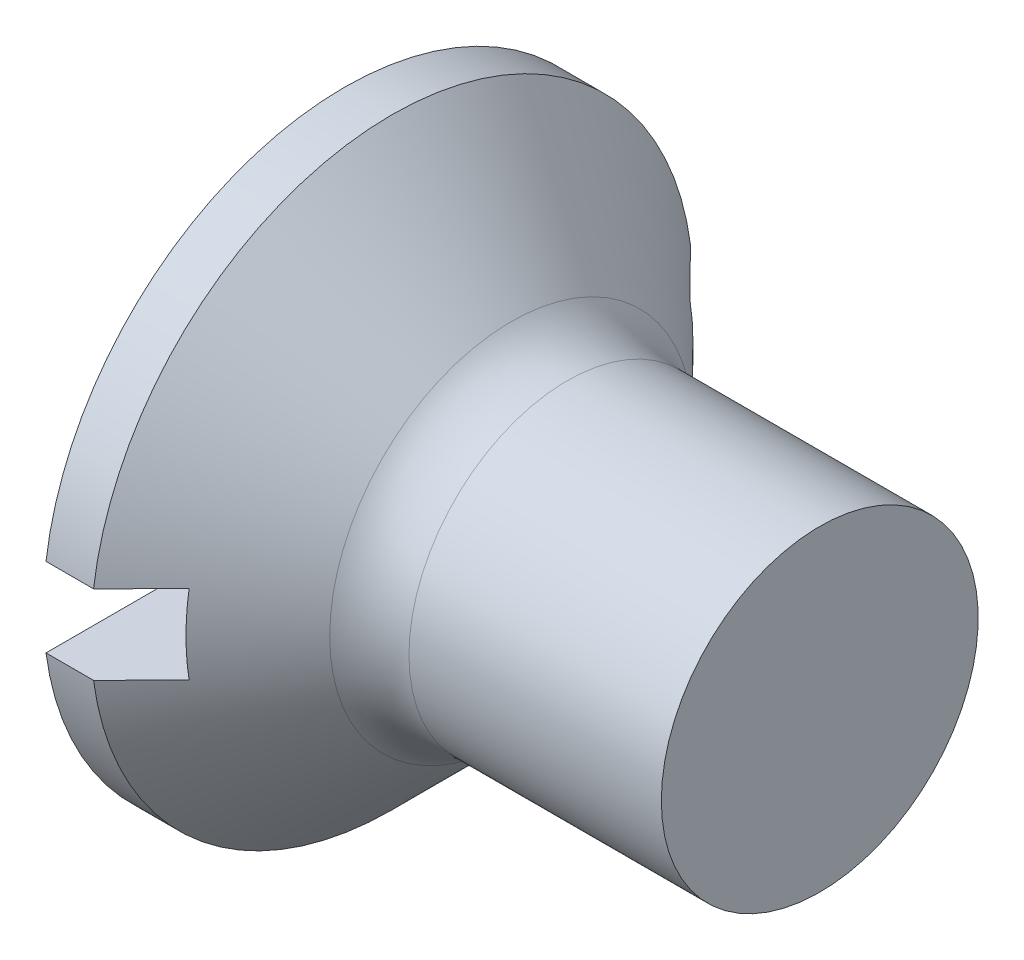
ISO-10303-21;
HEADER;
FILE_DESCRIPTION(('STEP AP214'),'2;1');
FILE_NAME('part.step','',(''),(''),'','','');
FILE_SCHEMA(('AUTOMOTIVE_DESIGN { 1 0 10303 214 1 1 1 1 }'));
ENDSEC;
DATA;
#1=APPLICATION_CONTEXT('core data for automotive mechanical design processes');
#2=APPLICATION_PROTOCOL_DEFINITION('international standard','automotive_design',2000,#1);
#3=PRODUCT_CONTEXT('',#1,'mechanical');
#4=PRODUCT('Part','Part','',(#3));
#5=PRODUCT_RELATED_PRODUCT_CATEGORY('part','',(#4));
#6=PRODUCT_DEFINITION_FORMATION('','',#4);
#7=PRODUCT_DEFINITION_CONTEXT('part definition',#1,'design');
#8=PRODUCT_DEFINITION('design','',#6,#7);
#9=PRODUCT_DEFINITION_SHAPE('','',#8);
#10=(LENGTH_UNIT() NAMED_UNIT(*) SI_UNIT(.MILLI.,.METRE.));
#11=(NAMED_UNIT(*) PLANE_ANGLE_UNIT() SI_UNIT($,.RADIAN.));
#12=(NAMED_UNIT(*) SI_UNIT($,.STERADIAN.) SOLID_ANGLE_UNIT());
#13=UNCERTAINTY_MEASURE_WITH_UNIT(LENGTH_MEASURE(1.E-05),#10,'distance_accuracy_value','');
#14=(GEOMETRIC_REPRESENTATION_CONTEXT(3) GLOBAL_UNCERTAINTY_ASSIGNED_CONTEXT((#13)) GLOBAL_UNIT_ASSIGNED_CONTEXT((#10,
#11,#12)) REPRESENTATION_CONTEXT('',''));
#15=CARTESIAN_POINT('',(0.,0.,0.));
#16=DIRECTION('',(0.,0.,1.));
#17=DIRECTION('',(1.,0.,0.));
#18=AXIS2_PLACEMENT_3D('',#15,#16,#17);
#19=CARTESIAN_POINT('',(0.,0.,0.));
#20=DIRECTION('',(-1.,0.,0.));
#21=DIRECTION('',(0.,0.,1.));
#22=AXIS2_PLACEMENT_3D('',#19,#20,#21);
#23=PLANE('',#22);
#24=DIRECTION('',(0.,0.,-1.));
#25=VECTOR('',#24,1.);
#26=CARTESIAN_POINT('',(0.,0.25,1.9));
#27=LINE('',#26,#25);
#28=CARTESIAN_POINT('',(0.,0.25,1.88348082018374));
#29=VERTEX_POINT('',#28);
#30=CARTESIAN_POINT('',(0.,0.25,-1.88348082018374));
#31=VERTEX_POINT('',#30);
#32=EDGE_CURVE('E176',#29,#31,#27,.T.);
#33=ORIENTED_EDGE('',*,*,#32,.F.);
#34=CARTESIAN_POINT('',(0.,0.,0.));
#35=DIRECTION('',(-1.,0.,0.));
#36=DIRECTION('',(0.,0.,1.));
#37=AXIS2_PLACEMENT_3D('',#34,#35,#36);
#38=CIRCLE('',#37,1.9);
#39=EDGE_CURVE('E141',#29,#31,#38,.T.);
#40=ORIENTED_EDGE('',*,*,#39,.T.);
#41=EDGE_LOOP('',(#33,#40));
#42=FACE_BOUND('',#41,.T.);
#43=ADVANCED_FACE('F35',(#42),#23,.T.);
#44=CARTESIAN_POINT('',(-6.34999999999999,0.,0.));
#45=DIRECTION('',(-1.,0.,0.));
#46=DIRECTION('',(0.,0.,1.));
#47=AXIS2_PLACEMENT_3D('',#44,#45,#46);
#48=CYLINDRICAL_SURFACE('',#47,1.9);
#49=DIRECTION('',(-1.,0.,0.));
#50=VECTOR('',#49,1.);
#51=CARTESIAN_POINT('',(-6.34999999999999,0.25,-1.88348082018374));
#52=LINE('',#51,#50);
#53=CARTESIAN_POINT('',(0.299999999999989,0.25,-1.88348082018376));
#54=VERTEX_POINT('',#53);
#55=EDGE_CURVE('E63',#31,#54,#52,.F.);
#56=ORIENTED_EDGE('',*,*,#55,.F.);
#57=ORIENTED_EDGE('',*,*,#39,.F.);
#58=DIRECTION('',(-1.,0.,0.));
#59=VECTOR('',#58,1.);
#60=CARTESIAN_POINT('',(-6.34999999999999,0.25,1.88348082018374));
#61=LINE('',#60,#59);
#62=CARTESIAN_POINT('',(0.300000000000003,0.25,1.88348082018374));
#63=VERTEX_POINT('',#62);
#64=EDGE_CURVE('E182',#63,#29,#61,.T.);
#65=ORIENTED_EDGE('',*,*,#64,.F.);
#66=CARTESIAN_POINT('',(0.300000000000003,0.,0.));
#67=DIRECTION('',(-1.,0.,0.));
#68=DIRECTION('',(0.,0.,1.));
#69=AXIS2_PLACEMENT_3D('',#66,#67,#68);
#70=CIRCLE('',#69,1.9);
#71=EDGE_CURVE('E112',#63,#54,#70,.T.);
#72=ORIENTED_EDGE('',*,*,#71,.T.);
#73=EDGE_LOOP('',(#56,#57,#65,#72));
#74=FACE_BOUND('',#73,.T.);
#75=ADVANCED_FACE('F163',(#74),#48,.T.);
#76=DIRECTION('',(0.,0.,1.));
#77=VECTOR('',#76,1.);
#78=CARTESIAN_POINT('',(0.,-0.250000000000001,-1.9));
#79=LINE('',#78,#77);
#80=CARTESIAN_POINT('',(0.,-0.250000000000001,-1.88348082018374));
#81=VERTEX_POINT('',#80);
#82=CARTESIAN_POINT('',(0.,-0.250000000000001,1.88348082018374));
#83=VERTEX_POINT('',#82);
#84=EDGE_CURVE('E106',#81,#83,#79,.T.);
#85=ORIENTED_EDGE('',*,*,#84,.F.);
#86=EDGE_CURVE('E131',#81,#83,#38,.T.);
#87=ORIENTED_EDGE('',*,*,#86,.T.);
#88=EDGE_LOOP('',(#85,#87));
#89=FACE_BOUND('',#88,.T.);
#90=ADVANCED_FACE('F161',(#89),#23,.T.);
#91=DIRECTION('',(-1.,0.,0.));
#92=VECTOR('',#91,1.);
#93=CARTESIAN_POINT('',(-6.34999999999999,-0.250000000000001,1.88348082018374));
#94=LINE('',#93,#92);
#95=CARTESIAN_POINT('',(0.299999999999989,-0.250000000000001,1.88348082018376));
#96=VERTEX_POINT('',#95);
#97=EDGE_CURVE('E132',#83,#96,#94,.F.);
#98=ORIENTED_EDGE('',*,*,#97,.F.);
#99=ORIENTED_EDGE('',*,*,#86,.F.);
#100=DIRECTION('',(-1.,0.,0.));
#101=VECTOR('',#100,1.);
#102=CARTESIAN_POINT('',(-6.34999999999999,-0.250000000000001,-1.88348082018374));
#103=LINE('',#102,#101);
#104=CARTESIAN_POINT('',(0.300000000000003,-0.250000000000001,-1.88348082018374));
#105=VERTEX_POINT('',#104);
#106=EDGE_CURVE('E121',#105,#81,#103,.T.);
#107=ORIENTED_EDGE('',*,*,#106,.F.);
#108=EDGE_CURVE('E129',#105,#96,#70,.T.);
#109=ORIENTED_EDGE('',*,*,#108,.T.);
#110=EDGE_LOOP('',(#98,#99,#107,#109));
#111=FACE_BOUND('',#110,.T.);
#112=ADVANCED_FACE('F128',(#111),#48,.T.);
#113=CARTESIAN_POINT('',(0.300000000000003,0.,0.));
#114=DIRECTION('',(-1.,0.,0.));
#115=DIRECTION('',(0.,0.,1.));
#116=AXIS2_PLACEMENT_3D('',#113,#114,#115);
#117=CONICAL_SURFACE('',#116,1.9,0.78539816339745);
#118=CARTESIAN_POINT('',(-1.98729422630551,0.25,-4.17982451038935));
#119=CARTESIAN_POINT('',(-1.84470913533547,0.25,-4.03698256603225));
#120=CARTESIAN_POINT('',(-1.70213517655014,0.25,-3.89412950070456));
#121=CARTESIAN_POINT('',(-1.41702186757104,0.25,-3.60838492143172));
#122=CARTESIAN_POINT('',(-1.27448251787976,0.25,-3.46549340698522));
#123=CARTESIAN_POINT('',(-0.989410499152169,0.25,-3.17961533117565));
#124=CARTESIAN_POINT('',(-0.846877845892992,0.25,-3.03662875407935));
#125=CARTESIAN_POINT('',(-0.561891165052778,0.25,-2.75058105917093));
#126=CARTESIAN_POINT('',(-0.419437136443918,0.25,-2.60751994238315));
#127=CARTESIAN_POINT('',(-0.131064292348537,0.25,-2.3176668049941));
#128=CARTESIAN_POINT('',(0.0148513539907664,0.25,-2.17087163179214));
#129=CARTESIAN_POINT('',(0.306462720413094,0.25,-1.87705115433807));
#130=CARTESIAN_POINT('',(0.452158431570259,0.25,-1.73002584121432));
#131=CARTESIAN_POINT('',(0.670327706151663,0.25,-1.50914686476255));
#132=CARTESIAN_POINT('',(0.742981250797221,0.25,-1.43547100609828));
#133=CARTESIAN_POINT('',(0.888099107922326,0.25,-1.28793053976864));
#134=CARTESIAN_POINT('',(0.960563417404761,0.25,-1.21406592915002));
#135=CARTESIAN_POINT('',(1.10516444224742,0.25,-1.0660275832816));
#136=CARTESIAN_POINT('',(1.17730118131636,0.25,-0.991853871173734));
#137=CARTESIAN_POINT('',(1.32099236723619,0.25,-0.84294514457437));
#138=CARTESIAN_POINT('',(1.39254683400264,0.25,-0.768210149450102));
#139=CARTESIAN_POINT('',(1.4825658678815,0.25,-0.672500233502236));
#140=CARTESIAN_POINT('',(1.50165114242041,0.25,-0.652110555381362));
#141=CARTESIAN_POINT('',(1.53968572913894,0.25,-0.611204724741305));
#142=CARTESIAN_POINT('',(1.55863503934745,0.25,-0.590688570396564));
#143=CARTESIAN_POINT('',(1.61514621539087,0.25,-0.528993825768736));
#144=CARTESIAN_POINT('',(1.65245554131459,0.25,-0.487580016311415));
#145=CARTESIAN_POINT('',(1.71225207904246,0.25,-0.419002643341745));
#146=CARTESIAN_POINT('',(1.73514735441112,0.25,-0.392195572563958));
#147=CARTESIAN_POINT('',(1.78011117382062,0.25,-0.337713683602133));
#148=CARTESIAN_POINT('',(1.80217634783667,0.25,-0.310036023298933));
#149=CARTESIAN_POINT('',(1.83405852164685,0.25,-0.26739675000213));
#150=CARTESIAN_POINT('',(1.84452887870795,0.25,-0.252926956129676));
#151=CARTESIAN_POINT('',(1.86480829380391,0.25,-0.223534103212474));
#152=CARTESIAN_POINT('',(1.87461759974615,0.25,-0.208611217166218));
#153=CARTESIAN_POINT('',(1.8932192565572,0.25,-0.178209466122465));
#154=CARTESIAN_POINT('',(1.90201523879352,0.25,-0.162732864604354));
#155=CARTESIAN_POINT('',(1.91807920679254,0.25,-0.13101950257968));
#156=CARTESIAN_POINT('',(1.92535000548919,0.25,-0.114784210217757));
#157=CARTESIAN_POINT('',(1.93762411485741,0.25,-0.0811668178626109));
#158=CARTESIAN_POINT('',(1.94259388017706,0.25,-0.063771739928644));
#159=CARTESIAN_POINT('',(1.94897989324943,0.25,-0.0284090713434214));
#160=CARTESIAN_POINT('',(1.95042002284216,0.25,-0.0104461659975856));
#161=CARTESIAN_POINT('',(1.94935644177881,0.25,0.0253992115742553));
#162=CARTESIAN_POINT('',(1.94684232540985,0.25,0.0432813469747596));
#163=CARTESIAN_POINT('',(1.93857592035239,0.25,0.0783510961631234));
#164=CARTESIAN_POINT('',(1.93280079704993,0.25,0.0955328861954527));
#165=CARTESIAN_POINT('',(1.91770670146767,0.25,0.13239784224318));
#166=CARTESIAN_POINT('',(1.9079044408816,0.25,0.151873654550218));
#167=CARTESIAN_POINT('',(1.88649113904698,0.25,0.189823155713473));
#168=CARTESIAN_POINT('',(1.87487561835218,0.25,0.208294205813897));
#169=CARTESIAN_POINT('',(1.85048324573877,0.25,0.244630361241057));
#170=CARTESIAN_POINT('',(1.83769879997766,0.25,0.262490290681415));
#171=CARTESIAN_POINT('',(1.81145322289458,0.25,0.297663877372688));
#172=CARTESIAN_POINT('',(1.79799297686919,0.25,0.314978203315155));
#173=CARTESIAN_POINT('',(1.75268964976738,0.25,0.371705919805397));
#174=CARTESIAN_POINT('',(1.71987651897858,0.25,0.410338972117884));
#175=CARTESIAN_POINT('',(1.65317458420771,0.25,0.486669402340337));
#176=CARTESIAN_POINT('',(1.61928533509996,0.25,0.524366381254672));
#177=CARTESIAN_POINT('',(1.55085976422305,0.25,0.599263041541323));
#178=CARTESIAN_POINT('',(1.51632262726528,0.25,0.636461979186223));
#179=CARTESIAN_POINT('',(1.44689518246044,0.25,0.710513545392871));
#180=CARTESIAN_POINT('',(1.41200494274365,0.25,0.747366238211863));
#181=CARTESIAN_POINT('',(1.30742637842109,0.25,0.857140556571603));
#182=CARTESIAN_POINT('',(1.23740074911625,0.25,0.929740569735702));
#183=CARTESIAN_POINT('',(1.09696472004179,0.25,1.07446651412946));
#184=CARTESIAN_POINT('',(1.02655462439956,0.25,1.14659274200916));
#185=CARTESIAN_POINT('',(0.834911887632562,0.25,1.3422369404478));
#186=CARTESIAN_POINT('',(0.713439687475853,0.25,1.46552022087721));
#187=CARTESIAN_POINT('',(0.470171078890065,0.25,1.71176788410888));
#188=CARTESIAN_POINT('',(0.34837466740016,0.25,1.83473226387866));
#189=CARTESIAN_POINT('',(-0.0173554901470557,0.25,2.20344593303904));
#190=CARTESIAN_POINT('',(-0.261551044831605,0.25,2.44893553827728));
#191=CARTESIAN_POINT('',(-0.752635037725528,0.25,2.94211353931879));
#192=CARTESIAN_POINT('',(-0.999526011157529,0.25,3.18979940617476));
#193=CARTESIAN_POINT('',(-1.49336982157244,0.25,3.68493789949824));
#194=CARTESIAN_POINT('',(-1.74032260728228,0.25,3.9323905770972));
#195=CARTESIAN_POINT('',(-1.98729422630551,0.25,4.17982451038934));
#196=B_SPLINE_CURVE_WITH_KNOTS('',3,(#118,#119,#120,#121,#122,#123,#124,#125,#126,#127,#128,
#129,#130,#131,#132,#133,#134,#135,#136,#137,#138,#139,#140,#141,#142,#143,#144,#145,#146,#147,
#148,#149,#150,#151,#152,#153,#154,#155,#156,#157,#158,#159,#160,#161,#162,#163,#164,#165,#166,
#167,#168,#169,#170,#171,#172,#173,#174,#175,#176,#177,#178,#179,#180,#181,#182,#183,#184,#185,
#186,#187,#188,#189,#190,#191,#192,#193,#194,#195),.UNSPECIFIED.,.F.,.F.,(4,2,2,2,2,2,2,2,2,2,2,
2,2,2,2,2,2,2,2,2,2,2,2,2,2,2,2,2,2,2,2,2,2,2,2,2,2,2,4),(0.,0.605482431225346,1.21097318233229,
1.81665168711006,2.42232207714462,3.04325825770119,3.66421899502984,3.9746379866888,
4.28506186531045,4.59546290620963,4.90585328539815,4.98963728022583,5.0734224872371,
5.24062546089035,5.34637861192141,5.45252280357737,5.50609279605942,5.55964258562074,
5.61299407520157,5.66624628494618,5.72025211290859,5.77389151113381,5.82767229932756,
5.88183443280842,5.94707677036331,6.01248290927082,6.07834909802315,6.14413114583103,
6.29613571362599,6.44820399733714,6.60047850521135,6.75272417196467,7.0553230067041,
7.35770972427607,7.87692671428236,8.39614862363949,9.43493043579255,10.4840877501042,
11.5328806536616),.UNSPECIFIED.);
#197=CARTESIAN_POINT('',(0.6,0.25,-1.58034806292791));
#198=VERTEX_POINT('',#197);
#199=EDGE_CURVE('E11',#54,#198,#196,.T.);
#200=ORIENTED_EDGE('',*,*,#199,.F.);
#201=ORIENTED_EDGE('',*,*,#71,.F.);
#202=CARTESIAN_POINT('',(0.6,0.25,1.58034806292791));
#203=VERTEX_POINT('',#202);
#204=EDGE_CURVE('E39',#203,#63,#196,.T.);
#205=ORIENTED_EDGE('',*,*,#204,.F.);
#206=CARTESIAN_POINT('',(0.6,0.,0.));
#207=DIRECTION('',(-1.,0.,0.));
#208=DIRECTION('',(0.,0.,1.));
#209=AXIS2_PLACEMENT_3D('',#206,#207,#208);
#210=CIRCLE('',#209,1.6);
#211=CARTESIAN_POINT('',(0.6,-0.250000000000001,1.58034806292791));
#212=VERTEX_POINT('',#211);
#213=EDGE_CURVE('E92',#203,#212,#210,.F.);
#214=ORIENTED_EDGE('',*,*,#213,.T.);
#215=CARTESIAN_POINT('',(-1.98729422630551,-0.250000000000001,4.17982451038935));
#216=CARTESIAN_POINT('',(-1.84470913533547,-0.250000000000001,4.03698256603225));
#217=CARTESIAN_POINT('',(-1.70213517655014,-0.250000000000001,3.89412950070456));
#218=CARTESIAN_POINT('',(-1.41702186757104,-0.250000000000001,3.60838492143172));
#219=CARTESIAN_POINT('',(-1.27448251787976,-0.250000000000001,3.46549340698522));
#220=CARTESIAN_POINT('',(-0.989410499152169,-0.250000000000001,3.17961533117565));
#221=CARTESIAN_POINT('',(-0.846877845892993,-0.250000000000001,3.03662875407935));
#222=CARTESIAN_POINT('',(-0.56189116505278,-0.250000000000001,2.75058105917093));
#223=CARTESIAN_POINT('',(-0.419437136443919,-0.250000000000001,2.60751994238315));
#224=CARTESIAN_POINT('',(-0.131064292348538,-0.250000000000001,2.3176668049941));
#225=CARTESIAN_POINT('',(0.0148513539907651,-0.250000000000001,2.17087163179215));
#226=CARTESIAN_POINT('',(0.306462720413092,-0.250000000000001,1.87705115433807));
#227=CARTESIAN_POINT('',(0.452158431570258,-0.250000000000001,1.73002584121432));
#228=CARTESIAN_POINT('',(0.670327706151662,-0.250000000000001,1.50914686476255));
#229=CARTESIAN_POINT('',(0.74298125079722,-0.250000000000001,1.43547100609828));
#230=CARTESIAN_POINT('',(0.888099107922325,-0.250000000000001,1.28793053976864));
#231=CARTESIAN_POINT('',(0.960563417404761,-0.250000000000001,1.21406592915002));
#232=CARTESIAN_POINT('',(1.10516444224742,-0.250000000000001,1.0660275832816));
#233=CARTESIAN_POINT('',(1.17730118131636,-0.250000000000001,0.991853871173734));
#234=CARTESIAN_POINT('',(1.32099236723619,-0.250000000000001,0.84294514457437));
#235=CARTESIAN_POINT('',(1.39254683400264,-0.250000000000001,0.768210149450102));
#236=CARTESIAN_POINT('',(1.4825658678815,-0.250000000000001,0.672500233502236));
#237=CARTESIAN_POINT('',(1.50165114242041,-0.250000000000001,0.652110555381362));
#238=CARTESIAN_POINT('',(1.53968572913894,-0.250000000000001,0.611204724741305));
#239=CARTESIAN_POINT('',(1.55863503934745,-0.250000000000001,0.590688570396564));
#240=CARTESIAN_POINT('',(1.61514621539087,-0.250000000000001,0.528993825768736));
#241=CARTESIAN_POINT('',(1.65245554131459,-0.250000000000001,0.487580016311415));
#242=CARTESIAN_POINT('',(1.71225207904246,-0.250000000000001,0.419002643341745));
#243=CARTESIAN_POINT('',(1.73514735441111,-0.250000000000001,0.392195572563957));
#244=CARTESIAN_POINT('',(1.78011117382062,-0.250000000000001,0.337713683602133));
#245=CARTESIAN_POINT('',(1.80217634783667,-0.250000000000001,0.310036023298933));
#246=CARTESIAN_POINT('',(1.83405852164685,-0.250000000000001,0.26739675000213));
#247=CARTESIAN_POINT('',(1.84452887870795,-0.250000000000001,0.252926956129675));
#248=CARTESIAN_POINT('',(1.86480829380391,-0.250000000000001,0.223534103212473));
#249=CARTESIAN_POINT('',(1.87461759974615,-0.250000000000001,0.208611217166217));
#250=CARTESIAN_POINT('',(1.8932192565572,-0.250000000000001,0.178209466122464));
#251=CARTESIAN_POINT('',(1.90201523879352,-0.250000000000001,0.162732864604353));
#252=CARTESIAN_POINT('',(1.91807920679254,-0.250000000000001,0.131019502579679));
#253=CARTESIAN_POINT('',(1.92535000548919,-0.250000000000001,0.114784210217756));
#254=CARTESIAN_POINT('',(1.93762411485741,-0.250000000000001,0.0811668178626096));
#255=CARTESIAN_POINT('',(1.94259388017706,-0.250000000000001,0.0637717399286428));
#256=CARTESIAN_POINT('',(1.94897989324943,-0.250000000000001,0.0284090713434201));
#257=CARTESIAN_POINT('',(1.95042002284216,-0.250000000000001,0.0104461659975843));
#258=CARTESIAN_POINT('',(1.94935644177881,-0.250000000000001,-0.0253992115742565));
#259=CARTESIAN_POINT('',(1.94684232540985,-0.250000000000001,-0.0432813469747608));
#260=CARTESIAN_POINT('',(1.93857592035239,-0.250000000000001,-0.0783510961631245));
#261=CARTESIAN_POINT('',(1.93280079704993,-0.250000000000001,-0.0955328861954537));
#262=CARTESIAN_POINT('',(1.91770670146766,-0.250000000000001,-0.132397842243181));
#263=CARTESIAN_POINT('',(1.9079044408816,-0.250000000000001,-0.15187365455022));
#264=CARTESIAN_POINT('',(1.88649113904698,-0.250000000000001,-0.189823155713475));
#265=CARTESIAN_POINT('',(1.87487561835218,-0.250000000000001,-0.208294205813898));
#266=CARTESIAN_POINT('',(1.85048324573876,-0.250000000000001,-0.244630361241059));
#267=CARTESIAN_POINT('',(1.83769879997766,-0.250000000000001,-0.262490290681418));
#268=CARTESIAN_POINT('',(1.81145322289457,-0.250000000000001,-0.29766387737269));
#269=CARTESIAN_POINT('',(1.79799297686919,-0.250000000000001,-0.314978203315158));
#270=CARTESIAN_POINT('',(1.75268964976738,-0.250000000000001,-0.3717059198054));
#271=CARTESIAN_POINT('',(1.71987651897858,-0.250000000000001,-0.410338972117888));
#272=CARTESIAN_POINT('',(1.6531745842077,-0.250000000000001,-0.486669402340342));
#273=CARTESIAN_POINT('',(1.61928533509996,-0.250000000000001,-0.524366381254677));
#274=CARTESIAN_POINT('',(1.55085976422304,-0.250000000000001,-0.599263041541329));
#275=CARTESIAN_POINT('',(1.51632262726528,-0.250000000000001,-0.636461979186229));
#276=CARTESIAN_POINT('',(1.44689518246043,-0.250000000000001,-0.710513545392877));
#277=CARTESIAN_POINT('',(1.41200494274364,-0.250000000000001,-0.74736623821187));
#278=CARTESIAN_POINT('',(1.30742637842108,-0.250000000000001,-0.857140556571611));
#279=CARTESIAN_POINT('',(1.23740074911624,-0.250000000000001,-0.92974056973571));
#280=CARTESIAN_POINT('',(1.09696472004178,-0.250000000000001,-1.07446651412947));
#281=CARTESIAN_POINT('',(1.02655462439955,-0.250000000000001,-1.14659274200917));
#282=CARTESIAN_POINT('',(0.83491188763255,-0.250000000000001,-1.34223694044781));
#283=CARTESIAN_POINT('',(0.713439687475841,-0.250000000000001,-1.46552022087722));
#284=CARTESIAN_POINT('',(0.470171078890054,-0.250000000000001,-1.71176788410889));
#285=CARTESIAN_POINT('',(0.348374667400149,-0.250000000000001,-1.83473226387867));
#286=CARTESIAN_POINT('',(-0.0173554901470656,-0.250000000000001,-2.20344593303905));
#287=CARTESIAN_POINT('',(-0.261551044831614,-0.250000000000001,-2.44893553827729));
#288=CARTESIAN_POINT('',(-0.752635037725536,-0.250000000000001,-2.9421135393188));
#289=CARTESIAN_POINT('',(-0.999526011157535,-0.250000000000001,-3.18979940617476));
#290=CARTESIAN_POINT('',(-1.49336982157245,-0.250000000000001,-3.68493789949824));
#291=CARTESIAN_POINT('',(-1.74032260728228,-0.250000000000001,-3.9323905770972));
#292=CARTESIAN_POINT('',(-1.98729422630551,-0.250000000000001,-4.17982451038935));
#293=B_SPLINE_CURVE_WITH_KNOTS('',3,(#215,#216,#217,#218,#219,#220,#221,#222,#223,#224,#225,
#226,#227,#228,#229,#230,#231,#232,#233,#234,#235,#236,#237,#238,#239,#240,#241,#242,#243,#244,
#245,#246,#247,#248,#249,#250,#251,#252,#253,#254,#255,#256,#257,#258,#259,#260,#261,#262,#263,
#264,#265,#266,#267,#268,#269,#270,#271,#272,#273,#274,#275,#276,#277,#278,#279,#280,#281,#282,
#283,#284,#285,#286,#287,#288,#289,#290,#291,#292),.UNSPECIFIED.,.F.,.F.,(4,2,2,2,2,2,2,2,2,2,2,
2,2,2,2,2,2,2,2,2,2,2,2,2,2,2,2,2,2,2,2,2,2,2,2,2,2,2,4),(0.,0.605482431225346,1.21097318233229,
1.81665168711006,2.42232207714462,3.04325825770119,3.66421899502984,3.9746379866888,
4.28506186531045,4.59546290620963,4.90585328539815,4.98963728022583,5.0734224872371,
5.24062546089035,5.34637861192141,5.45252280357737,5.50609279605942,5.55964258562074,
5.61299407520157,5.66624628494618,5.72025211290859,5.77389151113381,5.82767229932756,
5.88183443280842,5.94707677036331,6.01248290927082,6.07834909802315,6.14413114583103,
6.29613571362599,6.44820399733714,6.60047850521136,6.75272417196468,7.05532300670411,
7.35770972427609,7.87692671428238,8.3961486236395,9.43493043579256,10.4840877501042,
11.5328806536615),.UNSPECIFIED.);
#294=EDGE_CURVE('E100',#96,#212,#293,.T.);
#295=ORIENTED_EDGE('',*,*,#294,.F.);
#296=ORIENTED_EDGE('',*,*,#108,.F.);
#297=CARTESIAN_POINT('',(0.6,-0.250000000000001,-1.58034806292791));
#298=VERTEX_POINT('',#297);
#299=EDGE_CURVE('E49',#298,#105,#293,.T.);
#300=ORIENTED_EDGE('',*,*,#299,.F.);
#301=EDGE_CURVE('E103',#298,#198,#210,.F.);
#302=ORIENTED_EDGE('',*,*,#301,.T.);
#303=EDGE_LOOP('',(#200,#201,#205,#214,#295,#296,#300,#302));
#304=FACE_BOUND('',#303,.T.);
#305=CARTESIAN_POINT('',(1.05355339059327,0.,0.));
#306=DIRECTION('',(-1.,0.,0.));
#307=DIRECTION('',(0.,0.,1.));
#308=AXIS2_PLACEMENT_3D('',#305,#306,#307);
#309=CIRCLE('',#308,1.14644660940673);
#310=CARTESIAN_POINT('',(1.05355339059327,0.,1.14644660940673));
#311=VERTEX_POINT('',#310);
#312=EDGE_CURVE('E142',#311,#311,#309,.T.);
#313=ORIENTED_EDGE('',*,*,#312,.T.);
#314=EDGE_LOOP('',(#313));
#315=FACE_BOUND('',#314,.T.);
#316=ADVANCED_FACE('F109',(#304,#315),#117,.T.);
#317=CARTESIAN_POINT('',(-6.34999999999999,0.,0.));
#318=DIRECTION('',(-1.,0.,0.));
#319=DIRECTION('',(0.,0.,1.));
#320=AXIS2_PLACEMENT_3D('',#317,#318,#319);
#321=CYLINDRICAL_SURFACE('',#320,1.);
#322=CARTESIAN_POINT('',(1.40710678118655,0.,0.));
#323=DIRECTION('',(-1.,0.,0.));
#324=DIRECTION('',(0.,0.,1.));
#325=AXIS2_PLACEMENT_3D('',#322,#323,#324);
#326=CIRCLE('',#325,1.);
#327=CARTESIAN_POINT('',(1.40710678118655,0.,1.));
#328=VERTEX_POINT('',#327);
#329=EDGE_CURVE('E101',#328,#328,#326,.F.);
#330=ORIENTED_EDGE('',*,*,#329,.T.);
#331=EDGE_LOOP('',(#330));
#332=FACE_BOUND('',#331,.T.);
#333=CARTESIAN_POINT('',(3.,0.,0.));
#334=DIRECTION('',(-1.,0.,0.));
#335=DIRECTION('',(0.,0.,1.));
#336=AXIS2_PLACEMENT_3D('',#333,#334,#335);
#337=CIRCLE('',#336,1.);
#338=CARTESIAN_POINT('',(3.,0.,1.));
#339=VERTEX_POINT('',#338);
#340=EDGE_CURVE('E134',#339,#339,#337,.T.);
#341=ORIENTED_EDGE('',*,*,#340,.T.);
#342=EDGE_LOOP('',(#341));
#343=FACE_BOUND('',#342,.T.);
#344=ADVANCED_FACE('F148',(#332,#343),#321,.T.);
#345=CARTESIAN_POINT('',(3.,1.,0.));
#346=DIRECTION('',(1.,0.,0.));
#347=DIRECTION('',(0.,0.,-1.));
#348=AXIS2_PLACEMENT_3D('',#345,#346,#347);
#349=PLANE('',#348);
#350=ORIENTED_EDGE('',*,*,#340,.F.);
#351=EDGE_LOOP('',(#350));
#352=FACE_BOUND('',#351,.T.);
#353=ADVANCED_FACE('F153',(#352),#349,.T.);
#354=CARTESIAN_POINT('',(1.40710678118655,0.,0.));
#355=DIRECTION('',(-1.,0.,0.));
#356=DIRECTION('',(0.,0.,1.));
#357=AXIS2_PLACEMENT_3D('',#354,#355,#356);
#358=TOROIDAL_SURFACE('',#357,1.5,0.5);
#359=ORIENTED_EDGE('',*,*,#329,.F.);
#360=EDGE_LOOP('',(#359));
#361=FACE_BOUND('',#360,.T.);
#362=ORIENTED_EDGE('',*,*,#312,.F.);
#363=EDGE_LOOP('',(#362));
#364=FACE_BOUND('',#363,.T.);
#365=ADVANCED_FACE('F37',(#361,#364),#358,.F.);
#366=CARTESIAN_POINT('',(0.6,0.25,1.9));
#367=DIRECTION('',(0.,1.,0.));
#368=DIRECTION('',(0.,0.,1.));
#369=AXIS2_PLACEMENT_3D('',#366,#367,#368);
#370=PLANE('',#369);
#371=ORIENTED_EDGE('',*,*,#55,.T.);
#372=ORIENTED_EDGE('',*,*,#199,.T.);
#373=DIRECTION('',(0.,0.,-1.));
#374=VECTOR('',#373,1.);
#375=CARTESIAN_POINT('',(0.6,0.25,1.9));
#376=LINE('',#375,#374);
#377=EDGE_CURVE('E95',#203,#198,#376,.T.);
#378=ORIENTED_EDGE('',*,*,#377,.F.);
#379=ORIENTED_EDGE('',*,*,#204,.T.);
#380=ORIENTED_EDGE('',*,*,#64,.T.);
#381=ORIENTED_EDGE('',*,*,#32,.T.);
#382=EDGE_LOOP('',(#371,#372,#378,#379,#380,#381));
#383=FACE_BOUND('',#382,.T.);
#384=ADVANCED_FACE('F104',(#383),#370,.F.);
#385=CARTESIAN_POINT('',(0.6,-0.250000000000001,-1.9));
#386=DIRECTION('',(0.,-1.,0.));
#387=DIRECTION('',(0.,0.,-1.));
#388=AXIS2_PLACEMENT_3D('',#385,#386,#387);
#389=PLANE('',#388);
#390=ORIENTED_EDGE('',*,*,#97,.T.);
#391=ORIENTED_EDGE('',*,*,#294,.T.);
#392=DIRECTION('',(0.,0.,1.));
#393=VECTOR('',#392,1.);
#394=CARTESIAN_POINT('',(0.6,-0.250000000000001,-1.9));
#395=LINE('',#394,#393);
#396=EDGE_CURVE('E56',#298,#212,#395,.T.);
#397=ORIENTED_EDGE('',*,*,#396,.F.);
#398=ORIENTED_EDGE('',*,*,#299,.T.);
#399=ORIENTED_EDGE('',*,*,#106,.T.);
#400=ORIENTED_EDGE('',*,*,#84,.T.);
#401=EDGE_LOOP('',(#390,#391,#397,#398,#399,#400));
#402=FACE_BOUND('',#401,.T.);
#403=ADVANCED_FACE('F120',(#402),#389,.F.);
#404=CARTESIAN_POINT('',(0.6,0.25,-1.9));
#405=DIRECTION('',(-1.,0.,0.));
#406=DIRECTION('',(0.,0.,1.));
#407=AXIS2_PLACEMENT_3D('',#404,#405,#406);
#408=PLANE('',#407);
#409=ORIENTED_EDGE('',*,*,#396,.T.);
#410=ORIENTED_EDGE('',*,*,#213,.F.);
#411=ORIENTED_EDGE('',*,*,#377,.T.);
#412=ORIENTED_EDGE('',*,*,#301,.F.);
#413=EDGE_LOOP('',(#409,#410,#411,#412));
#414=FACE_BOUND('',#413,.T.);
#415=ADVANCED_FACE('F94',(#414),#408,.T.);
#416=CLOSED_SHELL('',(#43,#75,#90,#112,#316,#344,#353,#365,#384,#403,#415));
#417=MANIFOLD_SOLID_BREP('B2',#416);
#418=ADVANCED_BREP_SHAPE_REPRESENTATION('',(#18,#417),#14);
#419=SHAPE_DEFINITION_REPRESENTATION(#9,#418);
ENDSEC;
END-ISO-10303-21;
